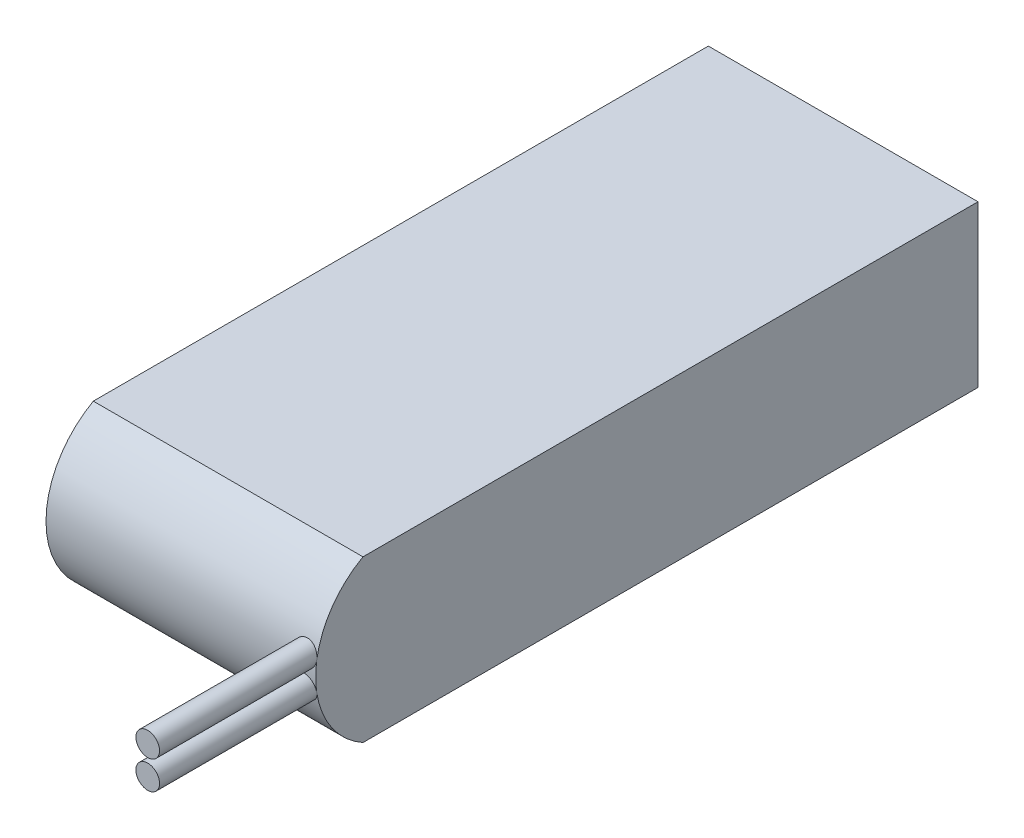
ISO-10303-21;
HEADER;
FILE_DESCRIPTION(('STEP AP214'),'2;1');
FILE_NAME('part.step','',(''),(''),'','','');
FILE_SCHEMA(('AUTOMOTIVE_DESIGN { 1 0 10303 214 1 1 1 1 }'));
ENDSEC;
DATA;
#1=APPLICATION_CONTEXT('core data for automotive mechanical design processes');
#2=APPLICATION_PROTOCOL_DEFINITION('international standard','automotive_design',2000,#1);
#3=PRODUCT_CONTEXT('',#1,'mechanical');
#4=PRODUCT('Part','Part','',(#3));
#5=PRODUCT_RELATED_PRODUCT_CATEGORY('part','',(#4));
#6=PRODUCT_DEFINITION_FORMATION('','',#4);
#7=PRODUCT_DEFINITION_CONTEXT('part definition',#1,'design');
#8=PRODUCT_DEFINITION('design','',#6,#7);
#9=PRODUCT_DEFINITION_SHAPE('','',#8);
#10=(LENGTH_UNIT() NAMED_UNIT(*) SI_UNIT(.MILLI.,.METRE.));
#11=(NAMED_UNIT(*) PLANE_ANGLE_UNIT() SI_UNIT($,.RADIAN.));
#12=(NAMED_UNIT(*) SI_UNIT($,.STERADIAN.) SOLID_ANGLE_UNIT());
#13=UNCERTAINTY_MEASURE_WITH_UNIT(LENGTH_MEASURE(1.E-05),#10,'distance_accuracy_value','');
#14=(GEOMETRIC_REPRESENTATION_CONTEXT(3) GLOBAL_UNCERTAINTY_ASSIGNED_CONTEXT((#13)) GLOBAL_UNIT_ASSIGNED_CONTEXT((#10,
#11,#12)) REPRESENTATION_CONTEXT('',''));
#15=CARTESIAN_POINT('',(0.,0.,0.));
#16=DIRECTION('',(0.,0.,1.));
#17=DIRECTION('',(1.,0.,0.));
#18=AXIS2_PLACEMENT_3D('',#15,#16,#17);
#19=CARTESIAN_POINT('',(0.,0.,130.));
#20=DIRECTION('',(1.,0.,0.));
#21=DIRECTION('',(0.,0.,-1.));
#22=AXIS2_PLACEMENT_3D('',#19,#20,#21);
#23=PLANE('',#22);
#24=DIRECTION('',(0.,-1.,0.));
#25=VECTOR('',#24,1.);
#26=CARTESIAN_POINT('',(0.,0.,0.));
#27=LINE('',#26,#25);
#28=CARTESIAN_POINT('',(0.,34.,0.));
#29=VERTEX_POINT('',#28);
#30=CARTESIAN_POINT('',(0.,0.,0.));
#31=VERTEX_POINT('',#30);
#32=EDGE_CURVE('E112',#29,#31,#27,.T.);
#33=ORIENTED_EDGE('',*,*,#32,.T.);
#34=DIRECTION('',(0.,0.,-1.));
#35=VECTOR('',#34,1.);
#36=CARTESIAN_POINT('',(0.,0.,130.));
#37=LINE('',#36,#35);
#38=CARTESIAN_POINT('',(0.,0.,130.));
#39=VERTEX_POINT('',#38);
#40=EDGE_CURVE('E138',#39,#31,#37,.T.);
#41=ORIENTED_EDGE('',*,*,#40,.F.);
#42=CARTESIAN_POINT('',(0.,17.,120.55));
#43=DIRECTION('',(1.,0.,0.));
#44=DIRECTION('',(0.,0.,-1.));
#45=AXIS2_PLACEMENT_3D('',#42,#43,#44);
#46=CIRCLE('',#45,19.45);
#47=CARTESIAN_POINT('',(0.,34.,130.));
#48=VERTEX_POINT('',#47);
#49=EDGE_CURVE('E111',#48,#39,#46,.T.);
#50=ORIENTED_EDGE('',*,*,#49,.F.);
#51=DIRECTION('',(0.,0.,-1.));
#52=VECTOR('',#51,1.);
#53=CARTESIAN_POINT('',(0.,34.,130.));
#54=LINE('',#53,#52);
#55=EDGE_CURVE('E55',#48,#29,#54,.T.);
#56=ORIENTED_EDGE('',*,*,#55,.T.);
#57=EDGE_LOOP('',(#33,#41,#50,#56));
#58=FACE_BOUND('',#57,.T.);
#59=ADVANCED_FACE('F34',(#58),#23,.F.);
#60=CARTESIAN_POINT('',(0.,0.,130.));
#61=DIRECTION('',(0.,1.,0.));
#62=DIRECTION('',(0.,0.,1.));
#63=AXIS2_PLACEMENT_3D('',#60,#61,#62);
#64=PLANE('',#63);
#65=DIRECTION('',(1.,0.,0.));
#66=VECTOR('',#65,1.);
#67=CARTESIAN_POINT('',(0.,0.,0.));
#68=LINE('',#67,#66);
#69=CARTESIAN_POINT('',(57.,0.,0.));
#70=VERTEX_POINT('',#69);
#71=EDGE_CURVE('E115',#31,#70,#68,.T.);
#72=ORIENTED_EDGE('',*,*,#71,.T.);
#73=DIRECTION('',(0.,0.,-1.));
#74=VECTOR('',#73,1.);
#75=CARTESIAN_POINT('',(57.,0.,130.));
#76=LINE('',#75,#74);
#77=CARTESIAN_POINT('',(57.,0.,130.));
#78=VERTEX_POINT('',#77);
#79=EDGE_CURVE('E142',#78,#70,#76,.T.);
#80=ORIENTED_EDGE('',*,*,#79,.F.);
#81=DIRECTION('',(1.,0.,0.));
#82=VECTOR('',#81,1.);
#83=CARTESIAN_POINT('',(0.,0.,130.));
#84=LINE('',#83,#82);
#85=EDGE_CURVE('E83',#39,#78,#84,.T.);
#86=ORIENTED_EDGE('',*,*,#85,.F.);
#87=ORIENTED_EDGE('',*,*,#40,.T.);
#88=EDGE_LOOP('',(#72,#80,#86,#87));
#89=FACE_BOUND('',#88,.T.);
#90=ADVANCED_FACE('F132',(#89),#64,.F.);
#91=CARTESIAN_POINT('',(57.,0.,130.));
#92=DIRECTION('',(-1.,0.,0.));
#93=DIRECTION('',(0.,0.,1.));
#94=AXIS2_PLACEMENT_3D('',#91,#92,#93);
#95=PLANE('',#94);
#96=CARTESIAN_POINT('',(57.,17.,120.55));
#97=DIRECTION('',(1.,0.,0.));
#98=DIRECTION('',(0.,0.,-1.));
#99=AXIS2_PLACEMENT_3D('',#96,#97,#98);
#100=CIRCLE('',#99,19.45);
#101=CARTESIAN_POINT('',(57.,20.,139.767244859761));
#102=VERTEX_POINT('',#101);
#103=CARTESIAN_POINT('',(57.,14.,139.767244859761));
#104=VERTEX_POINT('',#103);
#105=EDGE_CURVE('E93',#102,#104,#100,.T.);
#106=ORIENTED_EDGE('',*,*,#105,.T.);
#107=EDGE_CURVE('E96',#104,#78,#100,.T.);
#108=ORIENTED_EDGE('',*,*,#107,.T.);
#109=ORIENTED_EDGE('',*,*,#79,.T.);
#110=DIRECTION('',(0.,1.,0.));
#111=VECTOR('',#110,1.);
#112=CARTESIAN_POINT('',(57.,0.,0.));
#113=LINE('',#112,#111);
#114=CARTESIAN_POINT('',(57.,34.,0.));
#115=VERTEX_POINT('',#114);
#116=EDGE_CURVE('E74',#70,#115,#113,.T.);
#117=ORIENTED_EDGE('',*,*,#116,.T.);
#118=DIRECTION('',(0.,0.,-1.));
#119=VECTOR('',#118,1.);
#120=CARTESIAN_POINT('',(57.,34.,130.));
#121=LINE('',#120,#119);
#122=CARTESIAN_POINT('',(57.,34.,130.));
#123=VERTEX_POINT('',#122);
#124=EDGE_CURVE('E145',#123,#115,#121,.T.);
#125=ORIENTED_EDGE('',*,*,#124,.F.);
#126=EDGE_CURVE('E98',#123,#102,#100,.T.);
#127=ORIENTED_EDGE('',*,*,#126,.T.);
#128=EDGE_LOOP('',(#106,#108,#109,#117,#125,#127));
#129=FACE_BOUND('',#128,.T.);
#130=ADVANCED_FACE('F95',(#129),#95,.F.);
#131=CARTESIAN_POINT('',(0.,34.,130.));
#132=DIRECTION('',(0.,-1.,0.));
#133=DIRECTION('',(0.,0.,-1.));
#134=AXIS2_PLACEMENT_3D('',#131,#132,#133);
#135=PLANE('',#134);
#136=DIRECTION('',(-1.,0.,0.));
#137=VECTOR('',#136,1.);
#138=CARTESIAN_POINT('',(0.,34.,0.));
#139=LINE('',#138,#137);
#140=EDGE_CURVE('E77',#115,#29,#139,.T.);
#141=ORIENTED_EDGE('',*,*,#140,.T.);
#142=ORIENTED_EDGE('',*,*,#55,.F.);
#143=DIRECTION('',(-1.,0.,0.));
#144=VECTOR('',#143,1.);
#145=CARTESIAN_POINT('',(0.,34.,130.));
#146=LINE('',#145,#144);
#147=EDGE_CURVE('E248',#123,#48,#146,.T.);
#148=ORIENTED_EDGE('',*,*,#147,.F.);
#149=ORIENTED_EDGE('',*,*,#124,.T.);
#150=EDGE_LOOP('',(#141,#142,#148,#149));
#151=FACE_BOUND('',#150,.T.);
#152=ADVANCED_FACE('F198',(#151),#135,.F.);
#153=CARTESIAN_POINT('',(0.,0.,0.));
#154=DIRECTION('',(0.,0.,-1.));
#155=DIRECTION('',(-1.,0.,0.));
#156=AXIS2_PLACEMENT_3D('',#153,#154,#155);
#157=PLANE('',#156);
#158=ORIENTED_EDGE('',*,*,#140,.F.);
#159=ORIENTED_EDGE('',*,*,#116,.F.);
#160=ORIENTED_EDGE('',*,*,#71,.F.);
#161=ORIENTED_EDGE('',*,*,#32,.F.);
#162=EDGE_LOOP('',(#158,#159,#160,#161));
#163=FACE_BOUND('',#162,.T.);
#164=ADVANCED_FACE('F140',(#163),#157,.T.);
#165=CARTESIAN_POINT('',(0.,17.,120.55));
#166=DIRECTION('',(1.,0.,0.));
#167=DIRECTION('',(0.,0.,-1.));
#168=AXIS2_PLACEMENT_3D('',#165,#166,#167);
#169=CYLINDRICAL_SURFACE('',#168,19.45);
#170=ORIENTED_EDGE('',*,*,#107,.F.);
#171=CARTESIAN_POINT('',(52.,14.,139.767244859761));
#172=CARTESIAN_POINT('',(52.0000062159612,13.857177060345,139.744946476974));
#173=CARTESIAN_POINT('',(52.0122793940831,13.7145062107599,139.721027875421));
#174=CARTESIAN_POINT('',(52.0608227683726,13.4336265470204,139.670771709605));
#175=CARTESIAN_POINT('',(52.0971234660439,13.2954236388413,139.644431107402));
#176=CARTESIAN_POINT('',(52.1925112157584,13.0275377195619,139.59050140482));
#177=CARTESIAN_POINT('',(52.2515748620827,12.897846116599,139.562913612485));
#178=CARTESIAN_POINT('',(52.3908203153266,12.6503626587698,139.507828085392));
#179=CARTESIAN_POINT('',(52.4709979765407,12.5325684741379,139.480330334025));
#180=CARTESIAN_POINT('',(52.6510994283548,12.3111880819764,139.426722011835));
#181=CARTESIAN_POINT('',(52.7511741927137,12.2077214544136,139.400624114219));
#182=CARTESIAN_POINT('',(52.9680500288974,12.0191485064507,139.351678992662));
#183=CARTESIAN_POINT('',(53.084850624646,11.9340416636391,139.328831676235));
#184=CARTESIAN_POINT('',(53.3300618538331,11.7860836108608,139.288286767731));
#185=CARTESIAN_POINT('',(53.4582620181353,11.7229047331532,139.270514130379));
#186=CARTESIAN_POINT('',(53.7241503526188,11.6191584685312,139.240959821331));
#187=CARTESIAN_POINT('',(53.8618360225157,11.5785851484481,139.229176577699));
#188=CARTESIAN_POINT('',(54.1374264269278,11.5225832629358,139.212830207316));
#189=CARTESIAN_POINT('',(54.2751425159777,11.5062970019949,139.208020974578));
#190=CARTESIAN_POINT('',(54.5514315059592,11.4967115599086,139.205196246598));
#191=CARTESIAN_POINT('',(54.6900042668544,11.5034087160201,139.207179668848));
#192=CARTESIAN_POINT('',(54.9607231792232,11.5391157634076,139.217661001615));
#193=CARTESIAN_POINT('',(55.0929438364034,11.5676094562597,139.226008186569));
#194=CARTESIAN_POINT('',(55.3506279295237,11.6453141335468,139.24843471971));
#195=CARTESIAN_POINT('',(55.4760909906343,11.6945262658572,139.262514385495));
#196=CARTESIAN_POINT('',(55.7185819239983,11.8128782738661,139.295668173967));
#197=CARTESIAN_POINT('',(55.8354770730269,11.8822718563786,139.314805580482));
#198=CARTESIAN_POINT('',(56.0560902749017,12.0386549308214,139.356756579939));
#199=CARTESIAN_POINT('',(56.1598059772814,12.1256475542728,139.379570826981));
#200=CARTESIAN_POINT('',(56.3550295215928,12.3182374125962,139.428394855704));
#201=CARTESIAN_POINT('',(56.4459724031222,12.4243860331838,139.454489397485));
#202=CARTESIAN_POINT('',(56.6088619314158,12.6501535720183,139.507710178605));
#203=CARTESIAN_POINT('',(56.6808055617023,12.769774624964,139.53483658099));
#204=CARTESIAN_POINT('',(56.8054364033136,13.0225919088079,139.589428861088));
#205=CARTESIAN_POINT('',(56.8575813977391,13.1560579514265,139.616885555379));
#206=CARTESIAN_POINT('',(56.9384017720416,13.430242845993,139.670115690268));
#207=CARTESIAN_POINT('',(56.9670771207491,13.5709617075731,139.695889128629));
#208=CARTESIAN_POINT('',(56.999912617277,13.8554417214703,139.744661574589));
#209=CARTESIAN_POINT('',(57.0041184812933,13.9991966965647,139.767665677289));
#210=CARTESIAN_POINT('',(56.9877523345134,14.2858046364852,139.810234346463));
#211=CARTESIAN_POINT('',(56.9671830002231,14.4286576970708,139.829799284215));
#212=CARTESIAN_POINT('',(56.9022434868777,14.7065483139646,139.864808960999));
#213=CARTESIAN_POINT('',(56.8583196212972,14.8416814580514,139.880323083483));
#214=CARTESIAN_POINT('',(56.7480594692205,15.1028677635443,139.907702441074));
#215=CARTESIAN_POINT('',(56.6817249578779,15.2289216431624,139.919567965046));
#216=CARTESIAN_POINT('',(56.5295697587151,15.4664448857669,139.939810251214));
#217=CARTESIAN_POINT('',(56.4440368524045,15.5780947462276,139.948233822108));
#218=CARTESIAN_POINT('',(56.2553777373226,15.785583551909,139.962329274802));
#219=CARTESIAN_POINT('',(56.1522518161485,15.88142275554,139.968001201579));
#220=CARTESIAN_POINT('',(55.9316414170577,16.054260497036,139.977186354807));
#221=CARTESIAN_POINT('',(55.8141968945539,16.1313097408657,139.980705430523));
#222=CARTESIAN_POINT('',(55.5680512273252,16.2646991178389,139.986211252452));
#223=CARTESIAN_POINT('',(55.4393499874739,16.3210390759547,139.988197985715));
#224=CARTESIAN_POINT('',(55.1740387708515,16.4115053567659,139.991148156673));
#225=CARTESIAN_POINT('',(55.0374121598656,16.4455829712887,139.992109353467));
#226=CARTESIAN_POINT('',(54.7603767072301,16.4903599906534,139.99333500106));
#227=CARTESIAN_POINT('',(54.6199678294297,16.5010591719646,139.993599445197));
#228=CARTESIAN_POINT('',(54.3391585361807,16.4987737631479,139.993540663613));
#229=CARTESIAN_POINT('',(54.1987583721123,16.4857581706045,139.993216668626));
#230=CARTESIAN_POINT('',(53.9221353534442,16.4363523684057,139.991846714826));
#231=CARTESIAN_POINT('',(53.785912524661,16.3999620143213,139.990800751552));
#232=CARTESIAN_POINT('',(53.5215096793983,16.3048419565901,139.987631151562));
#233=CARTESIAN_POINT('',(53.3933299750359,16.2461113866447,139.985507473052));
#234=CARTESIAN_POINT('',(53.1486733180398,16.1079961210843,139.979657365635));
#235=CARTESIAN_POINT('',(53.0321958660295,16.0286123073358,139.975931005156));
#236=CARTESIAN_POINT('',(52.814409941794,15.8516074163905,139.966269391545));
#237=CARTESIAN_POINT('',(52.7130808281615,15.7540115708297,139.960337183326));
#238=CARTESIAN_POINT('',(52.5282568982369,15.5433294658733,139.945662797627));
#239=CARTESIAN_POINT('',(52.4447653940629,15.4302403360449,139.936920099044));
#240=CARTESIAN_POINT('',(52.2981110252408,15.1921438565104,139.916166378573));
#241=CARTESIAN_POINT('',(52.2349113947856,15.067158599802,139.904161341285));
#242=CARTESIAN_POINT('',(52.1303669601431,14.8088358920403,139.876616555676));
#243=CARTESIAN_POINT('',(52.08899906135,14.6755074345485,139.861080567557));
#244=CARTESIAN_POINT('',(52.0393675457219,14.451195041591,139.83248294777));
#245=CARTESIAN_POINT('',(52.0246073307151,14.3614655236757,139.820415814041));
#246=CARTESIAN_POINT('',(52.0049216108584,14.1811369619183,139.794864431208));
#247=CARTESIAN_POINT('',(51.9999960595951,14.0905379221817,139.781380188794));
#248=CARTESIAN_POINT('',(52.,14.,139.767244859761));
#249=B_SPLINE_CURVE_WITH_KNOTS('',3,(#171,#172,#173,#174,#175,#176,#177,#178,#179,#180,#181,
#182,#183,#184,#185,#186,#187,#188,#189,#190,#191,#192,#193,#194,#195,#196,#197,#198,#199,#200,
#201,#202,#203,#204,#205,#206,#207,#208,#209,#210,#211,#212,#213,#214,#215,#216,#217,#218,#219,
#220,#221,#222,#223,#224,#225,#226,#227,#228,#229,#230,#231,#232,#233,#234,#235,#236,#237,#238,
#239,#240,#241,#242,#243,#244,#245,#246,#247,#248),.UNSPECIFIED.,.T.,.F.,(4,2,2,2,2,2,2,2,2,2,2,
2,2,2,2,2,2,2,2,2,2,2,2,2,2,2,2,2,2,2,2,2,2,2,2,2,2,2,4),(0.,0.433319880383057,
0.867190892207757,1.3006169667148,1.73395800202502,2.17072203812958,2.6074736448591,
3.03738537010408,3.46718420532485,3.88141223949004,4.2955742634345,4.70022039791287,
5.10488895418155,5.51488252609291,5.92494911531177,6.34959136871602,6.77430100134478,
7.20992213533258,7.64554384785792,8.08035142885635,8.51511204107755,8.94184802680142,
9.36855021856924,9.78923913708407,10.2099211791549,10.629455098529,11.0489925635789,
11.4694448948497,11.8899012462189,12.3109076562337,12.7319166676066,13.1529420063397,
13.5739493707909,13.9943777288947,14.4148840851447,14.8346241907962,15.2539193815767,
15.5286096159067,15.803298553865),.UNSPECIFIED.);
#250=EDGE_CURVE('E11',#104,#104,#249,.T.);
#251=ORIENTED_EDGE('',*,*,#250,.F.);
#252=ORIENTED_EDGE('',*,*,#105,.F.);
#253=CARTESIAN_POINT('',(57.,20.,139.767244859761));
#254=CARTESIAN_POINT('',(56.9999937840388,20.142822939655,139.744946476974));
#255=CARTESIAN_POINT('',(56.9877206059169,20.2854937892401,139.721027875421));
#256=CARTESIAN_POINT('',(56.9391772316274,20.5663734529796,139.670771709605));
#257=CARTESIAN_POINT('',(56.9028765339561,20.7045763611587,139.644431107402));
#258=CARTESIAN_POINT('',(56.8074887842416,20.9724622804381,139.59050140482));
#259=CARTESIAN_POINT('',(56.7484251379173,21.102153883401,139.562913612485));
#260=CARTESIAN_POINT('',(56.6091796846734,21.3496373412303,139.507828085392));
#261=CARTESIAN_POINT('',(56.5290020234593,21.4674315258621,139.480330334025));
#262=CARTESIAN_POINT('',(56.3489005716452,21.6888119180236,139.426722011835));
#263=CARTESIAN_POINT('',(56.2488258072863,21.7922785455864,139.400624114219));
#264=CARTESIAN_POINT('',(56.0319499711026,21.9808514935493,139.351678992662));
#265=CARTESIAN_POINT('',(55.915149375354,22.0659583363609,139.328831676235));
#266=CARTESIAN_POINT('',(55.6699381461669,22.2139163891392,139.288286767731));
#267=CARTESIAN_POINT('',(55.5417379818646,22.2770952668468,139.270514130379));
#268=CARTESIAN_POINT('',(55.2758496473812,22.3808415314688,139.240959821331));
#269=CARTESIAN_POINT('',(55.1381639774843,22.4214148515519,139.229176577699));
#270=CARTESIAN_POINT('',(54.8625735730722,22.4774167370642,139.212830207316));
#271=CARTESIAN_POINT('',(54.7248574840223,22.4937029980051,139.208020974578));
#272=CARTESIAN_POINT('',(54.4485684940408,22.5032884400914,139.205196246598));
#273=CARTESIAN_POINT('',(54.3099957331456,22.4965912839799,139.207179668848));
#274=CARTESIAN_POINT('',(54.0392768207768,22.4608842365924,139.217661001615));
#275=CARTESIAN_POINT('',(53.9070561635966,22.4323905437403,139.226008186569));
#276=CARTESIAN_POINT('',(53.6493720704763,22.3546858664532,139.24843471971));
#277=CARTESIAN_POINT('',(53.5239090093657,22.3054737341428,139.262514385495));
#278=CARTESIAN_POINT('',(53.2814180760017,22.1871217261339,139.295668173967));
#279=CARTESIAN_POINT('',(53.1645229269731,22.1177281436214,139.314805580482));
#280=CARTESIAN_POINT('',(52.9439097250983,21.9613450691786,139.356756579939));
#281=CARTESIAN_POINT('',(52.8401940227186,21.8743524457272,139.379570826981));
#282=CARTESIAN_POINT('',(52.6449704784072,21.6817625874038,139.428394855704));
#283=CARTESIAN_POINT('',(52.5540275968778,21.5756139668162,139.454489397485));
#284=CARTESIAN_POINT('',(52.3911380685842,21.3498464279817,139.507710178605));
#285=CARTESIAN_POINT('',(52.3191944382977,21.230225375036,139.53483658099));
#286=CARTESIAN_POINT('',(52.1945635966864,20.9774080911921,139.589428861088));
#287=CARTESIAN_POINT('',(52.1424186022609,20.8439420485735,139.616885555379));
#288=CARTESIAN_POINT('',(52.0615982279584,20.569757154007,139.670115690268));
#289=CARTESIAN_POINT('',(52.0329228792509,20.4290382924269,139.695889128629));
#290=CARTESIAN_POINT('',(52.000087382723,20.1445582785297,139.744661574589));
#291=CARTESIAN_POINT('',(51.9958815187067,20.0008033034353,139.767665677289));
#292=CARTESIAN_POINT('',(52.0122476654866,19.7141953635148,139.810234346463));
#293=CARTESIAN_POINT('',(52.0328169997769,19.5713423029292,139.829799284215));
#294=CARTESIAN_POINT('',(52.0977565131223,19.2934516860354,139.864808960999));
#295=CARTESIAN_POINT('',(52.1416803787028,19.1583185419486,139.880323083483));
#296=CARTESIAN_POINT('',(52.2519405307795,18.8971322364557,139.907702441074));
#297=CARTESIAN_POINT('',(52.3182750421221,18.7710783568376,139.919567965046));
#298=CARTESIAN_POINT('',(52.4704302412849,18.5335551142331,139.939810251214));
#299=CARTESIAN_POINT('',(52.5559631475955,18.4219052537724,139.948233822108));
#300=CARTESIAN_POINT('',(52.7446222626774,18.214416448091,139.962329274802));
#301=CARTESIAN_POINT('',(52.8477481838515,18.11857724446,139.968001201579));
#302=CARTESIAN_POINT('',(53.0683585829423,17.945739502964,139.977186354807));
#303=CARTESIAN_POINT('',(53.1858031054461,17.8686902591343,139.980705430523));
#304=CARTESIAN_POINT('',(53.4319487726748,17.7353008821611,139.986211252452));
#305=CARTESIAN_POINT('',(53.5606500125261,17.6789609240453,139.988197985715));
#306=CARTESIAN_POINT('',(53.8259612291485,17.5884946432341,139.991148156673));
#307=CARTESIAN_POINT('',(53.9625878401344,17.5544170287113,139.992109353467));
#308=CARTESIAN_POINT('',(54.2396232927699,17.5096400093466,139.99333500106));
#309=CARTESIAN_POINT('',(54.3800321705703,17.4989408280354,139.993599445197));
#310=CARTESIAN_POINT('',(54.6608414638193,17.5012262368521,139.993540663613));
#311=CARTESIAN_POINT('',(54.8012416278877,17.5142418293955,139.993216668626));
#312=CARTESIAN_POINT('',(55.0778646465558,17.5636476315943,139.991846714826));
#313=CARTESIAN_POINT('',(55.214087475339,17.6000379856787,139.990800751552));
#314=CARTESIAN_POINT('',(55.4784903206017,17.6951580434099,139.987631151562));
#315=CARTESIAN_POINT('',(55.6066700249641,17.7538886133553,139.985507473052));
#316=CARTESIAN_POINT('',(55.8513266819602,17.8920038789157,139.979657365635));
#317=CARTESIAN_POINT('',(55.9678041339705,17.9713876926642,139.975931005156));
#318=CARTESIAN_POINT('',(56.185590058206,18.1483925836095,139.966269391545));
#319=CARTESIAN_POINT('',(56.2869191718385,18.2459884291703,139.960337183326));
#320=CARTESIAN_POINT('',(56.4717431017631,18.4566705341267,139.945662797627));
#321=CARTESIAN_POINT('',(56.5552346059371,18.5697596639551,139.936920099044));
#322=CARTESIAN_POINT('',(56.7018889747592,18.8078561434896,139.916166378573));
#323=CARTESIAN_POINT('',(56.7650886052144,18.932841400198,139.904161341285));
#324=CARTESIAN_POINT('',(56.8696330398569,19.1911641079597,139.876616555676));
#325=CARTESIAN_POINT('',(56.91100093865,19.3244925654515,139.861080567557));
#326=CARTESIAN_POINT('',(56.9606324542781,19.548804958409,139.83248294777));
#327=CARTESIAN_POINT('',(56.9753926692849,19.6385344763243,139.820415814041));
#328=CARTESIAN_POINT('',(56.9950783891416,19.8188630380817,139.794864431208));
#329=CARTESIAN_POINT('',(57.0000039404049,19.9094620778183,139.781380188794));
#330=CARTESIAN_POINT('',(57.,20.,139.767244859761));
#331=B_SPLINE_CURVE_WITH_KNOTS('',3,(#253,#254,#255,#256,#257,#258,#259,#260,#261,#262,#263,
#264,#265,#266,#267,#268,#269,#270,#271,#272,#273,#274,#275,#276,#277,#278,#279,#280,#281,#282,
#283,#284,#285,#286,#287,#288,#289,#290,#291,#292,#293,#294,#295,#296,#297,#298,#299,#300,#301,
#302,#303,#304,#305,#306,#307,#308,#309,#310,#311,#312,#313,#314,#315,#316,#317,#318,#319,#320,
#321,#322,#323,#324,#325,#326,#327,#328,#329,#330),.UNSPECIFIED.,.T.,.F.,(4,2,2,2,2,2,2,2,2,2,2,
2,2,2,2,2,2,2,2,2,2,2,2,2,2,2,2,2,2,2,2,2,2,2,2,2,2,2,4),(0.,0.433319880383062,
0.867190892207758,1.3006169667148,1.73395800202503,2.1707220381296,2.6074736448591,
3.03738537010408,3.46718420532486,3.88141223949005,4.2955742634345,4.70022039791287,
5.10488895418155,5.51488252609292,5.92494911531177,6.34959136871603,6.77430100134479,
7.20992213533258,7.64554384785793,8.08035142885636,8.51511204107756,8.94184802680142,
9.36855021856924,9.78923913708407,10.2099211791549,10.629455098529,11.0489925635789,
11.4694448948497,11.8899012462189,12.3109076562337,12.7319166676066,13.1529420063397,
13.5739493707909,13.9943777288948,14.4148840851447,14.8346241907963,15.2539193815767,
15.5286096159067,15.803298553865),.UNSPECIFIED.);
#332=EDGE_CURVE('E47',#102,#102,#331,.T.);
#333=ORIENTED_EDGE('',*,*,#332,.F.);
#334=ORIENTED_EDGE('',*,*,#126,.F.);
#335=ORIENTED_EDGE('',*,*,#147,.T.);
#336=ORIENTED_EDGE('',*,*,#49,.T.);
#337=ORIENTED_EDGE('',*,*,#85,.T.);
#338=EDGE_LOOP('',(#170,#251,#252,#333,#334,#335,#336,#337));
#339=FACE_BOUND('',#338,.T.);
#340=ADVANCED_FACE('F103',(#339),#169,.T.);
#341=CARTESIAN_POINT('',(54.5,20.,173.));
#342=DIRECTION('',(0.,0.,-1.));
#343=DIRECTION('',(-1.,0.,0.));
#344=AXIS2_PLACEMENT_3D('',#341,#342,#343);
#345=CYLINDRICAL_SURFACE('',#344,2.5);
#346=ORIENTED_EDGE('',*,*,#332,.T.);
#347=EDGE_LOOP('',(#346));
#348=FACE_BOUND('',#347,.T.);
#349=CARTESIAN_POINT('',(54.5,20.,173.));
#350=DIRECTION('',(0.,0.,-1.));
#351=DIRECTION('',(-1.,0.,0.));
#352=AXIS2_PLACEMENT_3D('',#349,#350,#351);
#353=CIRCLE('',#352,2.5);
#354=CARTESIAN_POINT('',(52.,20.,173.));
#355=VERTEX_POINT('',#354);
#356=EDGE_CURVE('E105',#355,#355,#353,.T.);
#357=ORIENTED_EDGE('',*,*,#356,.T.);
#358=EDGE_LOOP('',(#357));
#359=FACE_BOUND('',#358,.T.);
#360=ADVANCED_FACE('F154',(#348,#359),#345,.T.);
#361=CARTESIAN_POINT('',(54.5,20.,173.));
#362=DIRECTION('',(0.,0.,-1.));
#363=DIRECTION('',(-1.,0.,0.));
#364=AXIS2_PLACEMENT_3D('',#361,#362,#363);
#365=PLANE('',#364);
#366=ORIENTED_EDGE('',*,*,#356,.F.);
#367=EDGE_LOOP('',(#366));
#368=FACE_BOUND('',#367,.T.);
#369=ADVANCED_FACE('F129',(#368),#365,.F.);
#370=CARTESIAN_POINT('',(54.5,14.,173.));
#371=DIRECTION('',(0.,0.,-1.));
#372=DIRECTION('',(-1.,0.,0.));
#373=AXIS2_PLACEMENT_3D('',#370,#371,#372);
#374=CYLINDRICAL_SURFACE('',#373,2.5);
#375=ORIENTED_EDGE('',*,*,#250,.T.);
#376=EDGE_LOOP('',(#375));
#377=FACE_BOUND('',#376,.T.);
#378=CARTESIAN_POINT('',(54.5,14.,173.));
#379=DIRECTION('',(0.,0.,-1.));
#380=DIRECTION('',(-1.,0.,0.));
#381=AXIS2_PLACEMENT_3D('',#378,#379,#380);
#382=CIRCLE('',#381,2.5);
#383=CARTESIAN_POINT('',(52.,14.,173.));
#384=VERTEX_POINT('',#383);
#385=EDGE_CURVE('E107',#384,#384,#382,.T.);
#386=ORIENTED_EDGE('',*,*,#385,.T.);
#387=EDGE_LOOP('',(#386));
#388=FACE_BOUND('',#387,.T.);
#389=ADVANCED_FACE('F121',(#377,#388),#374,.T.);
#390=CARTESIAN_POINT('',(54.5,14.,173.));
#391=DIRECTION('',(0.,0.,-1.));
#392=DIRECTION('',(-1.,0.,0.));
#393=AXIS2_PLACEMENT_3D('',#390,#391,#392);
#394=PLANE('',#393);
#395=ORIENTED_EDGE('',*,*,#385,.F.);
#396=EDGE_LOOP('',(#395));
#397=FACE_BOUND('',#396,.T.);
#398=ADVANCED_FACE('F123',(#397),#394,.F.);
#399=CLOSED_SHELL('',(#59,#90,#130,#152,#164,#340,#360,#369,#389,#398));
#400=MANIFOLD_SOLID_BREP('B2',#399);
#401=ADVANCED_BREP_SHAPE_REPRESENTATION('',(#18,#400),#14);
#402=SHAPE_DEFINITION_REPRESENTATION(#9,#401);
ENDSEC;
END-ISO-10303-21;
